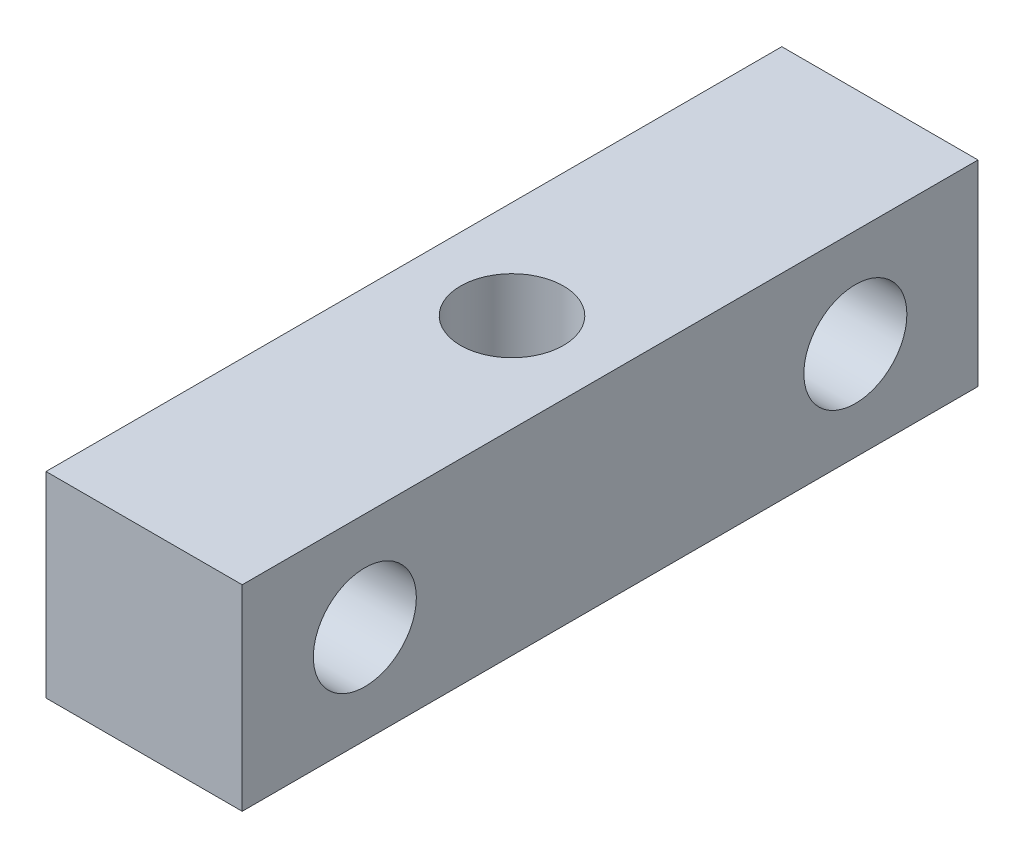
ISO-10303-21;
HEADER;
FILE_DESCRIPTION(('STEP AP214'),'2;1');
FILE_NAME('part.step','',(''),(''),'','','');
FILE_SCHEMA(('AUTOMOTIVE_DESIGN { 1 0 10303 214 1 1 1 1 }'));
ENDSEC;
DATA;
#1=APPLICATION_CONTEXT('core data for automotive mechanical design processes');
#2=APPLICATION_PROTOCOL_DEFINITION('international standard','automotive_design',2000,#1);
#3=PRODUCT_CONTEXT('',#1,'mechanical');
#4=PRODUCT('Part','Part','',(#3));
#5=PRODUCT_RELATED_PRODUCT_CATEGORY('part','',(#4));
#6=PRODUCT_DEFINITION_FORMATION('','',#4);
#7=PRODUCT_DEFINITION_CONTEXT('part definition',#1,'design');
#8=PRODUCT_DEFINITION('design','',#6,#7);
#9=PRODUCT_DEFINITION_SHAPE('','',#8);
#10=(LENGTH_UNIT() NAMED_UNIT(*) SI_UNIT(.MILLI.,.METRE.));
#11=(NAMED_UNIT(*) PLANE_ANGLE_UNIT() SI_UNIT($,.RADIAN.));
#12=(NAMED_UNIT(*) SI_UNIT($,.STERADIAN.) SOLID_ANGLE_UNIT());
#13=UNCERTAINTY_MEASURE_WITH_UNIT(LENGTH_MEASURE(1.E-05),#10,'distance_accuracy_value','');
#14=(GEOMETRIC_REPRESENTATION_CONTEXT(3) GLOBAL_UNCERTAINTY_ASSIGNED_CONTEXT((#13)) GLOBAL_UNIT_ASSIGNED_CONTEXT((#10,
#11,#12)) REPRESENTATION_CONTEXT('',''));
#15=CARTESIAN_POINT('',(0.,0.,0.));
#16=DIRECTION('',(0.,0.,1.));
#17=DIRECTION('',(1.,0.,0.));
#18=AXIS2_PLACEMENT_3D('',#15,#16,#17);
#19=CARTESIAN_POINT('',(4.,-4.,30.));
#20=DIRECTION('',(-1.,0.,0.));
#21=DIRECTION('',(0.,0.,1.));
#22=AXIS2_PLACEMENT_3D('',#19,#20,#21);
#23=PLANE('',#22);
#24=CARTESIAN_POINT('',(4.,0.,25.));
#25=DIRECTION('',(1.,0.,0.));
#26=DIRECTION('',(0.,0.,-1.));
#27=AXIS2_PLACEMENT_3D('',#24,#25,#26);
#28=CIRCLE('',#27,2.1);
#29=CARTESIAN_POINT('',(4.,0.,22.9));
#30=VERTEX_POINT('',#29);
#31=EDGE_CURVE('E149',#30,#30,#28,.T.);
#32=ORIENTED_EDGE('',*,*,#31,.F.);
#33=EDGE_LOOP('',(#32));
#34=FACE_BOUND('',#33,.T.);
#35=CARTESIAN_POINT('',(4.,0.,5.));
#36=DIRECTION('',(1.,0.,0.));
#37=DIRECTION('',(0.,0.,-1.));
#38=AXIS2_PLACEMENT_3D('',#35,#36,#37);
#39=CIRCLE('',#38,2.1);
#40=CARTESIAN_POINT('',(4.,0.,2.9));
#41=VERTEX_POINT('',#40);
#42=EDGE_CURVE('E145',#41,#41,#39,.T.);
#43=ORIENTED_EDGE('',*,*,#42,.F.);
#44=EDGE_LOOP('',(#43));
#45=FACE_BOUND('',#44,.T.);
#46=DIRECTION('',(0.,1.,0.));
#47=VECTOR('',#46,1.);
#48=CARTESIAN_POINT('',(4.,-4.,0.));
#49=LINE('',#48,#47);
#50=CARTESIAN_POINT('',(4.,-4.,0.));
#51=VERTEX_POINT('',#50);
#52=CARTESIAN_POINT('',(4.,4.,0.));
#53=VERTEX_POINT('',#52);
#54=EDGE_CURVE('E112',#51,#53,#49,.T.);
#55=ORIENTED_EDGE('',*,*,#54,.T.);
#56=DIRECTION('',(0.,0.,-1.));
#57=VECTOR('',#56,1.);
#58=CARTESIAN_POINT('',(4.,4.,30.));
#59=LINE('',#58,#57);
#60=CARTESIAN_POINT('',(4.,4.,30.));
#61=VERTEX_POINT('',#60);
#62=EDGE_CURVE('E11',#61,#53,#59,.T.);
#63=ORIENTED_EDGE('',*,*,#62,.F.);
#64=DIRECTION('',(0.,1.,0.));
#65=VECTOR('',#64,1.);
#66=CARTESIAN_POINT('',(4.,-4.,30.));
#67=LINE('',#66,#65);
#68=CARTESIAN_POINT('',(4.,-4.,30.));
#69=VERTEX_POINT('',#68);
#70=EDGE_CURVE('E96',#69,#61,#67,.T.);
#71=ORIENTED_EDGE('',*,*,#70,.F.);
#72=DIRECTION('',(0.,0.,-1.));
#73=VECTOR('',#72,1.);
#74=CARTESIAN_POINT('',(4.,-4.,30.));
#75=LINE('',#74,#73);
#76=EDGE_CURVE('E108',#69,#51,#75,.T.);
#77=ORIENTED_EDGE('',*,*,#76,.T.);
#78=EDGE_LOOP('',(#55,#63,#71,#77));
#79=FACE_BOUND('',#78,.T.);
#80=ADVANCED_FACE('F44',(#34,#45,#79),#23,.F.);
#81=CARTESIAN_POINT('',(-4.,4.,30.));
#82=DIRECTION('',(0.,-1.,0.));
#83=DIRECTION('',(0.,0.,-1.));
#84=AXIS2_PLACEMENT_3D('',#81,#82,#83);
#85=PLANE('',#84);
#86=CARTESIAN_POINT('',(0.,4.,15.));
#87=DIRECTION('',(0.,1.,0.));
#88=DIRECTION('',(0.,0.,1.));
#89=AXIS2_PLACEMENT_3D('',#86,#87,#88);
#90=CIRCLE('',#89,2.1);
#91=CARTESIAN_POINT('',(0.,4.,17.1));
#92=VERTEX_POINT('',#91);
#93=EDGE_CURVE('E133',#92,#92,#90,.T.);
#94=ORIENTED_EDGE('',*,*,#93,.F.);
#95=EDGE_LOOP('',(#94));
#96=FACE_BOUND('',#95,.T.);
#97=DIRECTION('',(-1.,0.,0.));
#98=VECTOR('',#97,1.);
#99=CARTESIAN_POINT('',(-4.,4.,0.));
#100=LINE('',#99,#98);
#101=CARTESIAN_POINT('',(-4.,4.,0.));
#102=VERTEX_POINT('',#101);
#103=EDGE_CURVE('E101',#53,#102,#100,.T.);
#104=ORIENTED_EDGE('',*,*,#103,.T.);
#105=DIRECTION('',(0.,0.,-1.));
#106=VECTOR('',#105,1.);
#107=CARTESIAN_POINT('',(-4.,4.,30.));
#108=LINE('',#107,#106);
#109=CARTESIAN_POINT('',(-4.,4.,30.));
#110=VERTEX_POINT('',#109);
#111=EDGE_CURVE('E53',#110,#102,#108,.T.);
#112=ORIENTED_EDGE('',*,*,#111,.F.);
#113=DIRECTION('',(-1.,0.,0.));
#114=VECTOR('',#113,1.);
#115=CARTESIAN_POINT('',(-4.,4.,30.));
#116=LINE('',#115,#114);
#117=EDGE_CURVE('E91',#61,#110,#116,.T.);
#118=ORIENTED_EDGE('',*,*,#117,.F.);
#119=ORIENTED_EDGE('',*,*,#62,.T.);
#120=EDGE_LOOP('',(#104,#112,#118,#119));
#121=FACE_BOUND('',#120,.T.);
#122=ADVANCED_FACE('F100',(#96,#121),#85,.F.);
#123=CARTESIAN_POINT('',(-4.,-4.,30.));
#124=DIRECTION('',(1.,0.,0.));
#125=DIRECTION('',(0.,0.,-1.));
#126=AXIS2_PLACEMENT_3D('',#123,#124,#125);
#127=PLANE('',#126);
#128=CARTESIAN_POINT('',(-4.,0.,25.));
#129=DIRECTION('',(1.,0.,0.));
#130=DIRECTION('',(0.,0.,-1.));
#131=AXIS2_PLACEMENT_3D('',#128,#129,#130);
#132=CIRCLE('',#131,2.1);
#133=CARTESIAN_POINT('',(-4.,0.,22.9));
#134=VERTEX_POINT('',#133);
#135=EDGE_CURVE('E137',#134,#134,#132,.T.);
#136=ORIENTED_EDGE('',*,*,#135,.T.);
#137=EDGE_LOOP('',(#136));
#138=FACE_BOUND('',#137,.T.);
#139=CARTESIAN_POINT('',(-4.,0.,5.));
#140=DIRECTION('',(1.,0.,0.));
#141=DIRECTION('',(0.,0.,-1.));
#142=AXIS2_PLACEMENT_3D('',#139,#140,#141);
#143=CIRCLE('',#142,2.1);
#144=CARTESIAN_POINT('',(-4.,0.,2.9));
#145=VERTEX_POINT('',#144);
#146=EDGE_CURVE('E141',#145,#145,#143,.T.);
#147=ORIENTED_EDGE('',*,*,#146,.T.);
#148=EDGE_LOOP('',(#147));
#149=FACE_BOUND('',#148,.T.);
#150=DIRECTION('',(0.,-1.,0.));
#151=VECTOR('',#150,1.);
#152=CARTESIAN_POINT('',(-4.,-4.,0.));
#153=LINE('',#152,#151);
#154=CARTESIAN_POINT('',(-4.,-4.,0.));
#155=VERTEX_POINT('',#154);
#156=EDGE_CURVE('E78',#102,#155,#153,.T.);
#157=ORIENTED_EDGE('',*,*,#156,.T.);
#158=DIRECTION('',(0.,0.,-1.));
#159=VECTOR('',#158,1.);
#160=CARTESIAN_POINT('',(-4.,-4.,30.));
#161=LINE('',#160,#159);
#162=CARTESIAN_POINT('',(-4.,-4.,30.));
#163=VERTEX_POINT('',#162);
#164=EDGE_CURVE('E103',#163,#155,#161,.T.);
#165=ORIENTED_EDGE('',*,*,#164,.F.);
#166=DIRECTION('',(0.,-1.,0.));
#167=VECTOR('',#166,1.);
#168=CARTESIAN_POINT('',(-4.,-4.,30.));
#169=LINE('',#168,#167);
#170=EDGE_CURVE('E94',#110,#163,#169,.T.);
#171=ORIENTED_EDGE('',*,*,#170,.F.);
#172=ORIENTED_EDGE('',*,*,#111,.T.);
#173=EDGE_LOOP('',(#157,#165,#171,#172));
#174=FACE_BOUND('',#173,.T.);
#175=ADVANCED_FACE('F104',(#138,#149,#174),#127,.F.);
#176=CARTESIAN_POINT('',(-4.,-4.,30.));
#177=DIRECTION('',(0.,1.,0.));
#178=DIRECTION('',(0.,0.,1.));
#179=AXIS2_PLACEMENT_3D('',#176,#177,#178);
#180=PLANE('',#179);
#181=CARTESIAN_POINT('',(0.,-4.,15.));
#182=DIRECTION('',(0.,1.,0.));
#183=DIRECTION('',(0.,0.,1.));
#184=AXIS2_PLACEMENT_3D('',#181,#182,#183);
#185=CIRCLE('',#184,2.1);
#186=CARTESIAN_POINT('',(0.,-4.,17.1));
#187=VERTEX_POINT('',#186);
#188=EDGE_CURVE('E116',#187,#187,#185,.T.);
#189=ORIENTED_EDGE('',*,*,#188,.T.);
#190=EDGE_LOOP('',(#189));
#191=FACE_BOUND('',#190,.T.);
#192=DIRECTION('',(1.,0.,0.));
#193=VECTOR('',#192,1.);
#194=CARTESIAN_POINT('',(-4.,-4.,0.));
#195=LINE('',#194,#193);
#196=EDGE_CURVE('E84',#155,#51,#195,.T.);
#197=ORIENTED_EDGE('',*,*,#196,.T.);
#198=ORIENTED_EDGE('',*,*,#76,.F.);
#199=DIRECTION('',(1.,0.,0.));
#200=VECTOR('',#199,1.);
#201=CARTESIAN_POINT('',(-4.,-4.,30.));
#202=LINE('',#201,#200);
#203=EDGE_CURVE('E61',#163,#69,#202,.T.);
#204=ORIENTED_EDGE('',*,*,#203,.F.);
#205=ORIENTED_EDGE('',*,*,#164,.T.);
#206=EDGE_LOOP('',(#197,#198,#204,#205));
#207=FACE_BOUND('',#206,.T.);
#208=ADVANCED_FACE('F126',(#191,#207),#180,.F.);
#209=CARTESIAN_POINT('',(0.,0.,30.));
#210=DIRECTION('',(0.,0.,-1.));
#211=DIRECTION('',(-1.,0.,0.));
#212=AXIS2_PLACEMENT_3D('',#209,#210,#211);
#213=PLANE('',#212);
#214=ORIENTED_EDGE('',*,*,#70,.T.);
#215=ORIENTED_EDGE('',*,*,#117,.T.);
#216=ORIENTED_EDGE('',*,*,#170,.T.);
#217=ORIENTED_EDGE('',*,*,#203,.T.);
#218=EDGE_LOOP('',(#214,#215,#216,#217));
#219=FACE_BOUND('',#218,.T.);
#220=ADVANCED_FACE('F92',(#219),#213,.F.);
#221=CARTESIAN_POINT('',(0.,0.,0.));
#222=DIRECTION('',(0.,0.,-1.));
#223=DIRECTION('',(-1.,0.,0.));
#224=AXIS2_PLACEMENT_3D('',#221,#222,#223);
#225=PLANE('',#224);
#226=ORIENTED_EDGE('',*,*,#54,.F.);
#227=ORIENTED_EDGE('',*,*,#196,.F.);
#228=ORIENTED_EDGE('',*,*,#156,.F.);
#229=ORIENTED_EDGE('',*,*,#103,.F.);
#230=EDGE_LOOP('',(#226,#227,#228,#229));
#231=FACE_BOUND('',#230,.T.);
#232=ADVANCED_FACE('F129',(#231),#225,.T.);
#233=CARTESIAN_POINT('',(0.,-4.,15.));
#234=DIRECTION('',(0.,1.,0.));
#235=DIRECTION('',(0.,0.,1.));
#236=AXIS2_PLACEMENT_3D('',#233,#234,#235);
#237=CYLINDRICAL_SURFACE('',#236,2.1);
#238=ORIENTED_EDGE('',*,*,#188,.F.);
#239=EDGE_LOOP('',(#238));
#240=FACE_BOUND('',#239,.T.);
#241=ORIENTED_EDGE('',*,*,#93,.T.);
#242=EDGE_LOOP('',(#241));
#243=FACE_BOUND('',#242,.T.);
#244=ADVANCED_FACE('F171',(#240,#243),#237,.F.);
#245=CARTESIAN_POINT('',(-4.,0.,5.));
#246=DIRECTION('',(1.,0.,0.));
#247=DIRECTION('',(0.,0.,-1.));
#248=AXIS2_PLACEMENT_3D('',#245,#246,#247);
#249=CYLINDRICAL_SURFACE('',#248,2.1);
#250=ORIENTED_EDGE('',*,*,#146,.F.);
#251=EDGE_LOOP('',(#250));
#252=FACE_BOUND('',#251,.T.);
#253=ORIENTED_EDGE('',*,*,#42,.T.);
#254=EDGE_LOOP('',(#253));
#255=FACE_BOUND('',#254,.T.);
#256=ADVANCED_FACE('F162',(#252,#255),#249,.F.);
#257=CARTESIAN_POINT('',(-4.,0.,25.));
#258=DIRECTION('',(1.,0.,0.));
#259=DIRECTION('',(0.,0.,-1.));
#260=AXIS2_PLACEMENT_3D('',#257,#258,#259);
#261=CYLINDRICAL_SURFACE('',#260,2.1);
#262=ORIENTED_EDGE('',*,*,#135,.F.);
#263=EDGE_LOOP('',(#262));
#264=FACE_BOUND('',#263,.T.);
#265=ORIENTED_EDGE('',*,*,#31,.T.);
#266=EDGE_LOOP('',(#265));
#267=FACE_BOUND('',#266,.T.);
#268=ADVANCED_FACE('F159',(#264,#267),#261,.F.);
#269=CLOSED_SHELL('',(#80,#122,#175,#208,#220,#232,#244,#256,#268));
#270=MANIFOLD_SOLID_BREP('B2',#269);
#271=ADVANCED_BREP_SHAPE_REPRESENTATION('',(#18,#270),#14);
#272=SHAPE_DEFINITION_REPRESENTATION(#9,#271);
ENDSEC;
END-ISO-10303-21;
